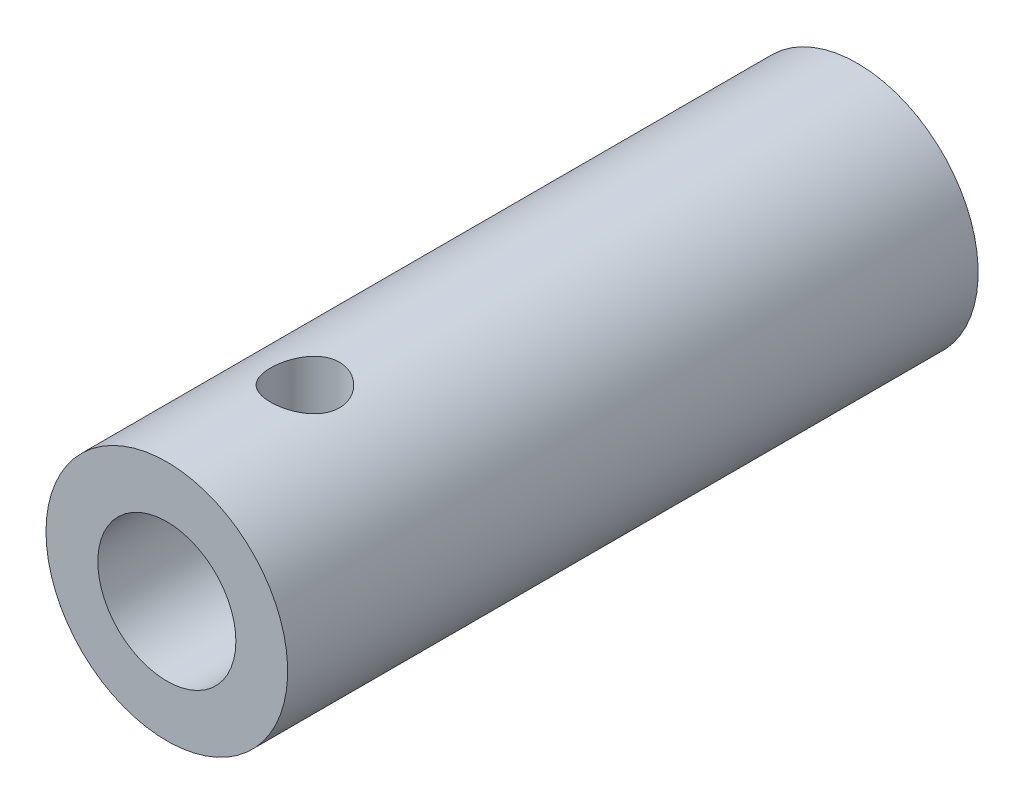
ISO-10303-21;
HEADER;
FILE_DESCRIPTION(('STEP AP214'),'2;1');
FILE_NAME('part.step','',(''),(''),'','','');
FILE_SCHEMA(('AUTOMOTIVE_DESIGN { 1 0 10303 214 1 1 1 1 }'));
ENDSEC;
DATA;
#1=APPLICATION_CONTEXT('core data for automotive mechanical design processes');
#2=APPLICATION_PROTOCOL_DEFINITION('international standard','automotive_design',2000,#1);
#3=PRODUCT_CONTEXT('',#1,'mechanical');
#4=PRODUCT('Part','Part','',(#3));
#5=PRODUCT_RELATED_PRODUCT_CATEGORY('part','',(#4));
#6=PRODUCT_DEFINITION_FORMATION('','',#4);
#7=PRODUCT_DEFINITION_CONTEXT('part definition',#1,'design');
#8=PRODUCT_DEFINITION('design','',#6,#7);
#9=PRODUCT_DEFINITION_SHAPE('','',#8);
#10=(LENGTH_UNIT() NAMED_UNIT(*) SI_UNIT(.MILLI.,.METRE.));
#11=(NAMED_UNIT(*) PLANE_ANGLE_UNIT() SI_UNIT($,.RADIAN.));
#12=(NAMED_UNIT(*) SI_UNIT($,.STERADIAN.) SOLID_ANGLE_UNIT());
#13=UNCERTAINTY_MEASURE_WITH_UNIT(LENGTH_MEASURE(1.E-05),#10,'distance_accuracy_value','');
#14=(GEOMETRIC_REPRESENTATION_CONTEXT(3) GLOBAL_UNCERTAINTY_ASSIGNED_CONTEXT((#13)) GLOBAL_UNIT_ASSIGNED_CONTEXT((#10,
#11,#12)) REPRESENTATION_CONTEXT('',''));
#15=CARTESIAN_POINT('',(0.,0.,0.));
#16=DIRECTION('',(0.,0.,1.));
#17=DIRECTION('',(1.,0.,0.));
#18=AXIS2_PLACEMENT_3D('',#15,#16,#17);
#19=CARTESIAN_POINT('',(0.,0.,40.));
#20=DIRECTION('',(0.,0.,-1.));
#21=DIRECTION('',(-1.,0.,0.));
#22=AXIS2_PLACEMENT_3D('',#19,#20,#21);
#23=CYLINDRICAL_SURFACE('',#22,7.);
#24=CARTESIAN_POINT('',(0.,7.,34.));
#25=CARTESIAN_POINT('',(0.109954902377251,6.99999869294341,33.999998060438));
#26=CARTESIAN_POINT('',(0.219929747872581,6.99738417402043,33.9909022110239));
#27=CARTESIAN_POINT('',(0.436691991196987,6.98720905945103,33.9548357298977));
#28=CARTESIAN_POINT('',(0.543478166829614,6.97964659210084,33.9278583339259));
#29=CARTESIAN_POINT('',(0.750704300737869,6.96040691349073,33.8569919615835));
#30=CARTESIAN_POINT('',(0.851152880848222,6.94873544106341,33.8131265638481));
#31=CARTESIAN_POINT('',(1.04326876112927,6.92249978316544,33.7098220085216));
#32=CARTESIAN_POINT('',(1.13493514117816,6.90793529508023,33.6503812215096));
#33=CARTESIAN_POINT('',(1.30929444685894,6.8770473462558,33.5159649893271));
#34=CARTESIAN_POINT('',(1.39172372238093,6.86069041945191,33.4406552461447));
#35=CARTESIAN_POINT('',(1.54297135792434,6.82826734915641,33.2773522568623));
#36=CARTESIAN_POINT('',(1.61178767707782,6.81220124959344,33.1893571123678));
#37=CARTESIAN_POINT('',(1.7351979000643,6.78183014875388,33.0010064172091));
#38=CARTESIAN_POINT('',(1.78947821103347,6.76756702506018,32.9004380149351));
#39=CARTESIAN_POINT('',(1.8802517055398,6.74291343840667,32.6911279882492));
#40=CARTESIAN_POINT('',(1.91674871555718,6.73252214244871,32.5823881279291));
#41=CARTESIAN_POINT('',(1.96998433013874,6.71713608196016,32.3627652368345));
#42=CARTESIAN_POINT('',(1.98720553202849,6.71200978570011,32.2520086372322));
#43=CARTESIAN_POINT('',(2.00290667789184,6.70734208201995,32.0290688515539));
#44=CARTESIAN_POINT('',(2.0013906940962,6.70779946107612,31.9168859807498));
#45=CARTESIAN_POINT('',(1.98004134762903,6.71413034409934,31.6981313885438));
#46=CARTESIAN_POINT('',(1.96080325728391,6.71982782697936,31.5914956488192));
#47=CARTESIAN_POINT('',(1.90551386085789,6.73571348382811,31.3830327803724));
#48=CARTESIAN_POINT('',(1.86946103481249,6.74590206376403,31.2812060872795));
#49=CARTESIAN_POINT('',(1.78110681137812,6.7697686351608,31.0837537555682));
#50=CARTESIAN_POINT('',(1.72860551172881,6.78348916405649,30.9882229275983));
#51=CARTESIAN_POINT('',(1.60898379167884,6.81285216882059,30.8071234387866));
#52=CARTESIAN_POINT('',(1.54186011673345,6.82849507221912,30.7215570022651));
#53=CARTESIAN_POINT('',(1.39190399673021,6.86066250656356,30.5594276243936));
#54=CARTESIAN_POINT('',(1.30857487484533,6.87719804572366,30.4833255240328));
#55=CARTESIAN_POINT('',(1.13013228238622,6.90876247218345,30.3460739963597));
#56=CARTESIAN_POINT('',(1.03501820148189,6.92379128137826,30.2849253439583));
#57=CARTESIAN_POINT('',(0.834923073091443,6.95076528065502,30.179071265226));
#58=CARTESIAN_POINT('',(0.729889817810003,6.96269275497229,30.1344597131958));
#59=CARTESIAN_POINT('',(0.513393229967468,6.98199251487585,30.0636661085832));
#60=CARTESIAN_POINT('',(0.401931525810145,6.98936594856255,30.0374794107547));
#61=CARTESIAN_POINT('',(0.179666388644349,6.99854874514672,30.0050267142906));
#62=CARTESIAN_POINT('',(0.0689613468605074,7.00053272850599,29.998135304627));
#63=CARTESIAN_POINT('',(-0.152026526805583,6.99922084707091,30.002727266301));
#64=CARTESIAN_POINT('',(-0.262309407757108,6.99592561580629,30.0142084328459));
#65=CARTESIAN_POINT('',(-0.477018633430315,6.98453926685206,30.0547104443163));
#66=CARTESIAN_POINT('',(-0.581518211734843,6.97654613017679,30.0833731813234));
#67=CARTESIAN_POINT('',(-0.784208686205639,6.95667998741883,30.1570005019847));
#68=CARTESIAN_POINT('',(-0.882398851248716,6.94480653265874,30.2019669708893));
#69=CARTESIAN_POINT('',(-1.07204168512003,6.91809961169145,30.3080233366451));
#70=CARTESIAN_POINT('',(-1.16330248654009,6.9032076317834,30.3694411988253));
#71=CARTESIAN_POINT('',(-1.33443852805947,6.87217947098441,30.5062525059511));
#72=CARTESIAN_POINT('',(-1.41431117084304,6.85604300755107,30.5816491300646));
#73=CARTESIAN_POINT('',(-1.56310642834007,6.82368619629443,30.7472093420494));
#74=CARTESIAN_POINT('',(-1.63158542740713,6.80748036858305,30.837775275559));
#75=CARTESIAN_POINT('',(-1.75239531606756,6.77738894734787,31.0294625886247));
#76=CARTESIAN_POINT('',(-1.80472676748669,6.76350327310608,31.1305836007713));
#77=CARTESIAN_POINT('',(-1.89137454118278,6.73978651242836,31.3400912109752));
#78=CARTESIAN_POINT('',(-1.92578633239653,6.72993400029434,31.4484357634976));
#79=CARTESIAN_POINT('',(-1.97579450067869,6.71542456669526,31.6697099355748));
#80=CARTESIAN_POINT('',(-1.99139657901586,6.71076607094366,31.7826381550764));
#81=CARTESIAN_POINT('',(-2.00298024246851,6.70731703127619,32.0052960329368));
#82=CARTESIAN_POINT('',(-1.99968027644404,6.70831160808103,32.1149855045567));
#83=CARTESIAN_POINT('',(-1.97524710957466,6.71554597206102,32.3321747306617));
#84=CARTESIAN_POINT('',(-1.95411450379873,6.72178558421114,32.4396745580919));
#85=CARTESIAN_POINT('',(-1.89505968816675,6.73866977160527,32.6483783711686));
#86=CARTESIAN_POINT('',(-1.85731091786365,6.74926877048974,32.7496353870112));
#87=CARTESIAN_POINT('',(-1.76622949301581,6.77367302842112,32.9444587344922));
#88=CARTESIAN_POINT('',(-1.71289408043152,6.78747885482392,33.0380237012732));
#89=CARTESIAN_POINT('',(-1.59006546534828,6.81731668949935,33.2181835218053));
#90=CARTESIAN_POINT('',(-1.52009227722731,6.83340763179064,33.304441391342));
#91=CARTESIAN_POINT('',(-1.36685984037934,6.86569845092232,33.4642238958098));
#92=CARTESIAN_POINT('',(-1.28359725072855,6.88189835417168,33.5377453191108));
#93=CARTESIAN_POINT('',(-1.10357432086539,6.91307959572365,33.6718371843266));
#94=CARTESIAN_POINT('',(-1.00652250235978,6.92801901037413,33.7320269872696));
#95=CARTESIAN_POINT('',(-0.803250529646657,6.95451395777971,33.835145785022));
#96=CARTESIAN_POINT('',(-0.697035424114735,6.96607133870287,33.8780842119331));
#97=CARTESIAN_POINT('',(-0.492916315335031,6.98327344725308,33.9408475513954));
#98=CARTESIAN_POINT('',(-0.395763007624387,6.98949684362076,33.9629735366846));
#99=CARTESIAN_POINT('',(-0.199078368786366,6.99786043852147,33.9925496572421));
#100=CARTESIAN_POINT('',(-0.0995473576160911,7.00000118333996,34.0000017559769));
#101=CARTESIAN_POINT('',(0.,7.,34.));
#102=B_SPLINE_CURVE_WITH_KNOTS('',3,(#24,#25,#26,#27,#28,#29,#30,#31,#32,#33,#34,#35,#36,#37,
#38,#39,#40,#41,#42,#43,#44,#45,#46,#47,#48,#49,#50,#51,#52,#53,#54,#55,#56,#57,#58,#59,#60,#61,
#62,#63,#64,#65,#66,#67,#68,#69,#70,#71,#72,#73,#74,#75,#76,#77,#78,#79,#80,#81,#82,#83,#84,#85,
#86,#87,#88,#89,#90,#91,#92,#93,#94,#95,#96,#97,#98,#99,#100,#101),.UNSPECIFIED.,.T.,.F.,(4,2,2,
2,2,2,2,2,2,2,2,2,2,2,2,2,2,2,2,2,2,2,2,2,2,2,2,2,2,2,2,2,2,2,2,2,2,2,4),(0.,0.329499312542343,
0.659123339795178,0.988288812895341,1.31748873543516,1.6544781153078,1.99151797873713,
2.33533075300056,2.67906951544809,3.01399509862749,3.34884789231232,3.67284785829332,
3.99687711786125,4.32500803291209,4.65321205577342,4.993785006025,5.33437560155448,
5.67687101104447,6.01928004014611,6.35045457698199,6.68158937434647,7.00605140479518,
7.33055096575527,7.6620752534445,7.99367503187786,8.33612104884333,8.67855514965296,
9.01914573366137,9.35963305787731,9.68726681616469,10.0148896418598,10.3391709629126,
10.6635096999757,10.9986765689036,11.3339278310847,11.6777797897016,12.0214434923408,
12.3197946803794,12.6181059442771),.UNSPECIFIED.);
#103=CARTESIAN_POINT('',(0.,7.,34.));
#104=VERTEX_POINT('',#103);
#105=EDGE_CURVE('E51',#104,#104,#102,.T.);
#106=ORIENTED_EDGE('',*,*,#105,.F.);
#107=EDGE_LOOP('',(#106));
#108=FACE_BOUND('',#107,.T.);
#109=CARTESIAN_POINT('',(0.,0.,40.));
#110=DIRECTION('',(0.,0.,-1.));
#111=DIRECTION('',(-1.,0.,0.));
#112=AXIS2_PLACEMENT_3D('',#109,#110,#111);
#113=CIRCLE('',#112,7.);
#114=CARTESIAN_POINT('',(-7.,0.,40.));
#115=VERTEX_POINT('',#114);
#116=EDGE_CURVE('E10',#115,#115,#113,.T.);
#117=ORIENTED_EDGE('',*,*,#116,.T.);
#118=EDGE_LOOP('',(#117));
#119=FACE_BOUND('',#118,.T.);
#120=CARTESIAN_POINT('',(0.,0.,0.));
#121=DIRECTION('',(0.,0.,-1.));
#122=DIRECTION('',(-1.,0.,0.));
#123=AXIS2_PLACEMENT_3D('',#120,#121,#122);
#124=CIRCLE('',#123,7.);
#125=CARTESIAN_POINT('',(-7.,0.,0.));
#126=VERTEX_POINT('',#125);
#127=EDGE_CURVE('E38',#126,#126,#124,.T.);
#128=ORIENTED_EDGE('',*,*,#127,.F.);
#129=EDGE_LOOP('',(#128));
#130=FACE_BOUND('',#129,.T.);
#131=ADVANCED_FACE('F31',(#108,#119,#130),#23,.T.);
#132=CARTESIAN_POINT('',(7.,0.,40.));
#133=DIRECTION('',(0.,0.,1.));
#134=DIRECTION('',(1.,0.,0.));
#135=AXIS2_PLACEMENT_3D('',#132,#133,#134);
#136=PLANE('',#135);
#137=CARTESIAN_POINT('',(0.,0.,40.));
#138=DIRECTION('',(0.,0.,1.));
#139=DIRECTION('',(1.,0.,0.));
#140=AXIS2_PLACEMENT_3D('',#137,#138,#139);
#141=CIRCLE('',#140,3.99999999999999);
#142=CARTESIAN_POINT('',(3.99999999999999,0.,40.));
#143=VERTEX_POINT('',#142);
#144=EDGE_CURVE('E46',#143,#143,#141,.T.);
#145=ORIENTED_EDGE('',*,*,#144,.F.);
#146=EDGE_LOOP('',(#145));
#147=FACE_BOUND('',#146,.T.);
#148=ORIENTED_EDGE('',*,*,#116,.F.);
#149=EDGE_LOOP('',(#148));
#150=FACE_BOUND('',#149,.T.);
#151=ADVANCED_FACE('F74',(#147,#150),#136,.T.);
#152=CARTESIAN_POINT('',(0.,0.,0.));
#153=DIRECTION('',(0.,0.,-1.));
#154=DIRECTION('',(-1.,0.,0.));
#155=AXIS2_PLACEMENT_3D('',#152,#153,#154);
#156=PLANE('',#155);
#157=CARTESIAN_POINT('',(0.,0.,0.));
#158=DIRECTION('',(0.,0.,1.));
#159=DIRECTION('',(1.,0.,0.));
#160=AXIS2_PLACEMENT_3D('',#157,#158,#159);
#161=CIRCLE('',#160,3.99999999999998);
#162=CARTESIAN_POINT('',(3.99999999999998,0.,0.));
#163=VERTEX_POINT('',#162);
#164=EDGE_CURVE('E42',#163,#163,#161,.T.);
#165=ORIENTED_EDGE('',*,*,#164,.T.);
#166=EDGE_LOOP('',(#165));
#167=FACE_BOUND('',#166,.T.);
#168=ORIENTED_EDGE('',*,*,#127,.T.);
#169=EDGE_LOOP('',(#168));
#170=FACE_BOUND('',#169,.T.);
#171=ADVANCED_FACE('F71',(#167,#170),#156,.T.);
#172=CARTESIAN_POINT('',(0.,0.,40.));
#173=DIRECTION('',(0.,0.,1.));
#174=DIRECTION('',(1.,0.,0.));
#175=AXIS2_PLACEMENT_3D('',#172,#173,#174);
#176=CYLINDRICAL_SURFACE('',#175,3.99999999999999);
#177=CARTESIAN_POINT('',(0.,3.99999999999999,34.));
#178=CARTESIAN_POINT('',(0.105143925902467,3.99999426810081,33.9999933953656));
#179=CARTESIAN_POINT('',(0.210413199395124,3.99580982039511,33.9916598537579));
#180=CARTESIAN_POINT('',(0.41784047053779,3.97948312074313,33.9586942393169));
#181=CARTESIAN_POINT('',(0.519992173427257,3.96732575657838,33.9340312140044));
#182=CARTESIAN_POINT('',(0.717867089760896,3.93632558806749,33.8696123827667));
#183=CARTESIAN_POINT('',(0.813613605878292,3.91750878355073,33.8299152315041));
#184=CARTESIAN_POINT('',(0.996945233613196,3.87491553031521,33.73685875727));
#185=CARTESIAN_POINT('',(1.08453098798012,3.85113947267049,33.6835005115023));
#186=CARTESIAN_POINT('',(1.25501563552382,3.79912516516122,33.5609655010294));
#187=CARTESIAN_POINT('',(1.33731042224422,3.77070398255073,33.4910270415207));
#188=CARTESIAN_POINT('',(1.48955888973396,3.71319940493485,33.3389570415059));
#189=CARTESIAN_POINT('',(1.55950316621353,3.68411552418068,33.2568162964551));
#190=CARTESIAN_POINT('',(1.69050400090055,3.62597902394694,33.0750333009532));
#191=CARTESIAN_POINT('',(1.75045067110327,3.59710373940262,32.9745278033082));
#192=CARTESIAN_POINT('',(1.85233645378139,3.54571957544639,32.7632653280276));
#193=CARTESIAN_POINT('',(1.89428842993266,3.52320615213978,32.6525157425545));
#194=CARTESIAN_POINT('',(1.95626488437717,3.48915734075616,32.4306697891562));
#195=CARTESIAN_POINT('',(1.97745171416088,3.47704543167426,32.3199910958652));
#196=CARTESIAN_POINT('',(2.00085398661769,3.46363779897054,32.0960423244411));
#197=CARTESIAN_POINT('',(2.00308817674614,3.46233138686575,31.9827749182577));
#198=CARTESIAN_POINT('',(1.98937457434458,3.47021860514495,31.7714279513693));
#199=CARTESIAN_POINT('',(1.97556911907364,3.47817527324026,31.6731519375539));
#200=CARTESIAN_POINT('',(1.93387969811386,3.50152457467699,31.4805561812539));
#201=CARTESIAN_POINT('',(1.9059912477953,3.51691957663551,31.3862377093894));
#202=CARTESIAN_POINT('',(1.836419560772,3.55374952825481,31.2015417348687));
#203=CARTESIAN_POINT('',(1.79443013423199,3.57531681327996,31.1113072024284));
#204=CARTESIAN_POINT('',(1.698083375336,3.62206808562806,30.93873141482));
#205=CARTESIAN_POINT('',(1.64372048762493,3.6472536956038,30.8563937287998));
#206=CARTESIAN_POINT('',(1.51613210982557,3.7022631580657,30.6909574945136));
#207=CARTESIAN_POINT('',(1.44138891673856,3.73227020473491,30.6090862528477));
#208=CARTESIAN_POINT('',(1.27911115748275,3.79095246600813,30.4585291628182));
#209=CARTESIAN_POINT('',(1.19157051314857,3.819627039176,30.3898496159322));
#210=CARTESIAN_POINT('',(1.0010330116637,3.87403974565926,30.2646286779406));
#211=CARTESIAN_POINT('',(0.897507183198818,3.89957968324013,30.2087990551085));
#212=CARTESIAN_POINT('',(0.680932430977594,3.94315762242483,30.115805941914));
#213=CARTESIAN_POINT('',(0.567891152530553,3.96120157887105,30.0786276299697));
#214=CARTESIAN_POINT('',(0.345532983321406,3.9864866748287,30.0270491925667));
#215=CARTESIAN_POINT('',(0.236683061096654,3.99449876602618,30.0110175285064));
#216=CARTESIAN_POINT('',(0.0175591998987056,4.00146026918206,29.997070537731));
#217=CARTESIAN_POINT('',(-0.092714039739815,4.00041397442636,29.9991466287211));
#218=CARTESIAN_POINT('',(-0.302465943971971,3.98982384506868,30.0204133768375));
#219=CARTESIAN_POINT('',(-0.402118816099857,3.98094491376335,30.03826506546));
#220=CARTESIAN_POINT('',(-0.596813784603878,3.95644342629679,30.0884761437902));
#221=CARTESIAN_POINT('',(-0.69185537138217,3.94082012668822,30.120837132907));
#222=CARTESIAN_POINT('',(-0.877777216899141,3.90368502827174,30.1999969328661));
#223=CARTESIAN_POINT('',(-0.968460794011601,3.8820176353926,30.2471821002326));
#224=CARTESIAN_POINT('',(-1.14092272339854,3.83487948634834,30.3542150712931));
#225=CARTESIAN_POINT('',(-1.22269725955318,3.80940711133875,30.4140682691908));
#226=CARTESIAN_POINT('',(-1.38353537857842,3.75416442672395,30.5515208506614));
#227=CARTESIAN_POINT('',(-1.46154415563805,3.72421769686997,30.6302857368903));
#228=CARTESIAN_POINT('',(-1.6037126422377,3.66524783217639,30.7998503025555));
#229=CARTESIAN_POINT('',(-1.66786277142374,3.63622534800093,30.8906582376958));
#230=CARTESIAN_POINT('',(-1.78341582895803,3.58102384412977,31.0872873083459));
#231=CARTESIAN_POINT('',(-1.83405099160049,3.5550505917812,31.193622532189));
#232=CARTESIAN_POINT('',(-1.9161656518694,3.51148144588268,31.4150201351499));
#233=CARTESIAN_POINT('',(-1.94766983173403,3.49387476443499,31.5300710529338));
#234=CARTESIAN_POINT('',(-1.98772337493374,3.47123002051603,31.7538204457694));
#235=CARTESIAN_POINT('',(-1.9981859928109,3.46514766930129,31.8620685068705));
#236=CARTESIAN_POINT('',(-2.0013783087524,3.46330709283205,32.0788941343291));
#237=CARTESIAN_POINT('',(-1.99411569324648,3.46754439252779,32.1874715374757));
#238=CARTESIAN_POINT('',(-1.96385225118661,3.48475724102152,32.3909670030669));
#239=CARTESIAN_POINT('',(-1.94241662868606,3.49686188965315,32.4862009402895));
#240=CARTESIAN_POINT('',(-1.88635071644882,3.52742032375304,32.6716162388487));
#241=CARTESIAN_POINT('',(-1.85171618231984,3.54587615139335,32.7617959641841));
#242=CARTESIAN_POINT('',(-1.76763149060113,3.5885706072907,32.9412497019731));
#243=CARTESIAN_POINT('',(-1.7173422756314,3.6131144479184,33.0300558036581));
#244=CARTESIAN_POINT('',(-1.60430194327478,3.66470663269719,33.1985490723625));
#245=CARTESIAN_POINT('',(-1.54154434248312,3.6917562759122,33.2782314610422));
#246=CARTESIAN_POINT('',(-1.39640665332274,3.74924646316183,33.4362839647093));
#247=CARTESIAN_POINT('',(-1.31256884599452,3.77969966613255,33.5133182047006));
#248=CARTESIAN_POINT('',(-1.13230961246639,3.8375550451986,33.6525259668705));
#249=CARTESIAN_POINT('',(-1.03588144661039,3.86495557252389,33.7146914789398));
#250=CARTESIAN_POINT('',(-0.831863193565892,3.91396019133073,33.8224727254241));
#251=CARTESIAN_POINT('',(-0.724199007553462,3.93552192987864,33.8679683384729));
#252=CARTESIAN_POINT('',(-0.501484202276173,3.97002682597972,33.9396163355148));
#253=CARTESIAN_POINT('',(-0.3864555991782,3.98299446726134,33.9658236936114));
#254=CARTESIAN_POINT('',(-0.22520389298179,3.99390923826954,33.9877948221715));
#255=CARTESIAN_POINT('',(-0.18032375888313,3.996187306805,33.9923652817327));
#256=CARTESIAN_POINT('',(-0.0903034636101832,3.9992339395363,33.9984693310282));
#257=CARTESIAN_POINT('',(-0.0451632952932569,4.0000024620676,34.0000028369404));
#258=CARTESIAN_POINT('',(0.,3.99999999999999,34.));
#259=B_SPLINE_CURVE_WITH_KNOTS('',3,(#177,#178,#179,#180,#181,#182,#183,#184,#185,#186,#187,
#188,#189,#190,#191,#192,#193,#194,#195,#196,#197,#198,#199,#200,#201,#202,#203,#204,#205,#206,
#207,#208,#209,#210,#211,#212,#213,#214,#215,#216,#217,#218,#219,#220,#221,#222,#223,#224,#225,
#226,#227,#228,#229,#230,#231,#232,#233,#234,#235,#236,#237,#238,#239,#240,#241,#242,#243,#244,
#245,#246,#247,#248,#249,#250,#251,#252,#253,#254,#255,#256,#257,#258),.UNSPECIFIED.,.T.,.F.,(4,
2,2,2,2,2,2,2,2,2,2,2,2,2,2,2,2,2,2,2,2,2,2,2,2,2,2,2,2,2,2,2,2,2,2,2,2,2,2,2,4),(0.,
0.315248514840584,0.631096299418393,0.945724310984594,1.26032752116313,1.59396351743618,
1.92785247530807,2.28763452861506,2.64715895796561,2.98516024280458,3.32282714658039,
3.62011424818639,3.91749607851355,4.22180480336974,4.52625042520442,4.86929882667755,
5.21251069197371,5.57166044428879,5.93052433824557,6.25966580942689,6.5886512902295,
6.89213813012242,7.19565843261861,7.50785712055795,7.82018901496676,8.16319221288835,
8.50643177230861,8.86629364323449,9.22569023890899,9.55058615006091,9.87534119729355,
10.1691586049771,10.463070575767,10.7767291356057,11.0905512228726,11.4425048551434,
11.7946476676249,12.1492802732705,12.502898172423,12.6383056026783,12.7737167702213),.UNSPECIFIED.);
#260=CARTESIAN_POINT('',(0.,3.99999999999999,34.));
#261=VERTEX_POINT('',#260);
#262=EDGE_CURVE('E57',#261,#261,#259,.T.);
#263=ORIENTED_EDGE('',*,*,#262,.T.);
#264=EDGE_LOOP('',(#263));
#265=FACE_BOUND('',#264,.T.);
#266=ORIENTED_EDGE('',*,*,#164,.F.);
#267=EDGE_LOOP('',(#266));
#268=FACE_BOUND('',#267,.T.);
#269=ORIENTED_EDGE('',*,*,#144,.T.);
#270=EDGE_LOOP('',(#269));
#271=FACE_BOUND('',#270,.T.);
#272=ADVANCED_FACE('F64',(#265,#268,#271),#176,.F.);
#273=CARTESIAN_POINT('',(0.,7.,32.));
#274=DIRECTION('',(0.,1.,0.));
#275=DIRECTION('',(0.,0.,1.));
#276=AXIS2_PLACEMENT_3D('',#273,#274,#275);
#277=CYLINDRICAL_SURFACE('',#276,2.);
#278=ORIENTED_EDGE('',*,*,#105,.T.);
#279=EDGE_LOOP('',(#278));
#280=FACE_BOUND('',#279,.T.);
#281=ORIENTED_EDGE('',*,*,#262,.F.);
#282=EDGE_LOOP('',(#281));
#283=FACE_BOUND('',#282,.T.);
#284=ADVANCED_FACE('F61',(#280,#283),#277,.F.);
#285=CLOSED_SHELL('',(#131,#151,#171,#272,#284));
#286=MANIFOLD_SOLID_BREP('B2',#285);
#287=ADVANCED_BREP_SHAPE_REPRESENTATION('',(#18,#286),#14);
#288=SHAPE_DEFINITION_REPRESENTATION(#9,#287);
ENDSEC;
END-ISO-10303-21;
